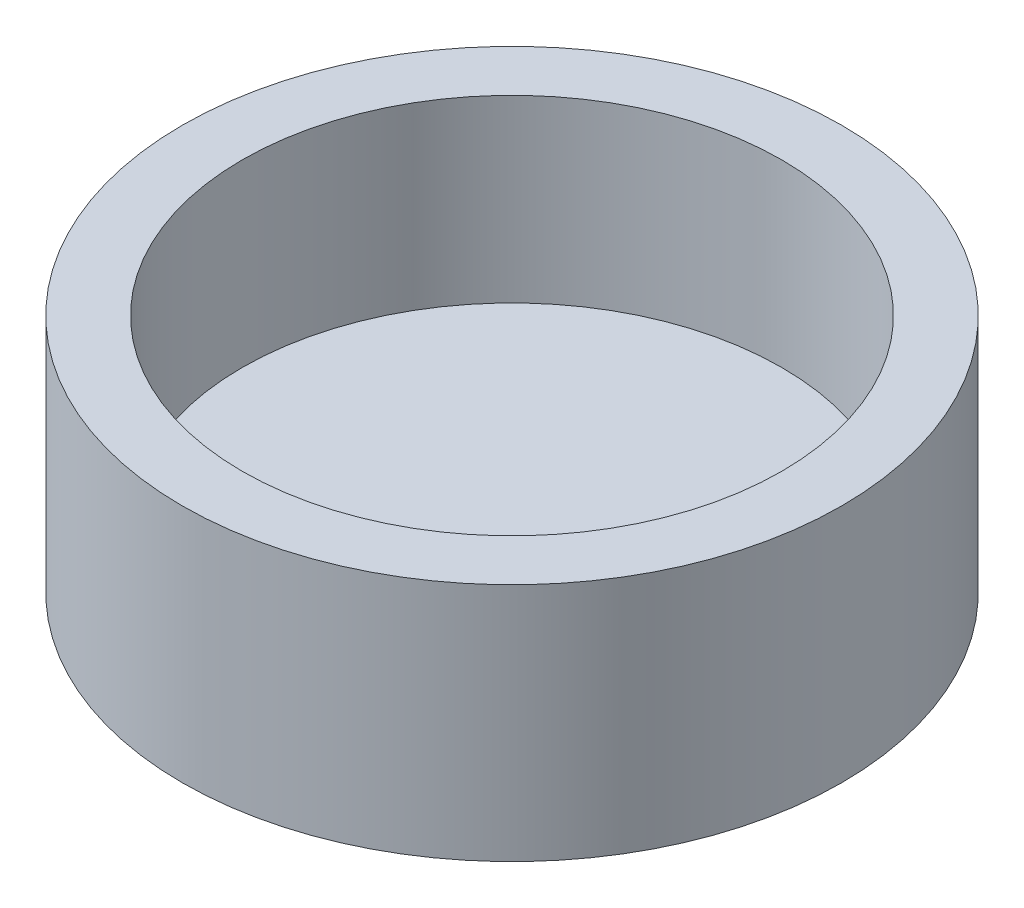
ISO-10303-21;
HEADER;
FILE_DESCRIPTION(('STEP AP214'),'2;1');
FILE_NAME('part.step','',(''),(''),'','','');
FILE_SCHEMA(('AUTOMOTIVE_DESIGN { 1 0 10303 214 1 1 1 1 }'));
ENDSEC;
DATA;
#1=APPLICATION_CONTEXT('core data for automotive mechanical design processes');
#2=APPLICATION_PROTOCOL_DEFINITION('international standard','automotive_design',2000,#1);
#3=PRODUCT_CONTEXT('',#1,'mechanical');
#4=PRODUCT('Part','Part','',(#3));
#5=PRODUCT_RELATED_PRODUCT_CATEGORY('part','',(#4));
#6=PRODUCT_DEFINITION_FORMATION('','',#4);
#7=PRODUCT_DEFINITION_CONTEXT('part definition',#1,'design');
#8=PRODUCT_DEFINITION('design','',#6,#7);
#9=PRODUCT_DEFINITION_SHAPE('','',#8);
#10=(LENGTH_UNIT() NAMED_UNIT(*) SI_UNIT(.MILLI.,.METRE.));
#11=(NAMED_UNIT(*) PLANE_ANGLE_UNIT() SI_UNIT($,.RADIAN.));
#12=(NAMED_UNIT(*) SI_UNIT($,.STERADIAN.) SOLID_ANGLE_UNIT());
#13=UNCERTAINTY_MEASURE_WITH_UNIT(LENGTH_MEASURE(1.E-05),#10,'distance_accuracy_value','');
#14=(GEOMETRIC_REPRESENTATION_CONTEXT(3) GLOBAL_UNCERTAINTY_ASSIGNED_CONTEXT((#13)) GLOBAL_UNIT_ASSIGNED_CONTEXT((#10,
#11,#12)) REPRESENTATION_CONTEXT('',''));
#15=CARTESIAN_POINT('',(0.,0.,0.));
#16=DIRECTION('',(0.,0.,1.));
#17=DIRECTION('',(1.,0.,0.));
#18=AXIS2_PLACEMENT_3D('',#15,#16,#17);
#19=CARTESIAN_POINT('',(0.,4.,0.));
#20=DIRECTION('',(0.,-1.,0.));
#21=DIRECTION('',(0.,0.,-1.));
#22=AXIS2_PLACEMENT_3D('',#19,#20,#21);
#23=CYLINDRICAL_SURFACE('',#22,5.5);
#24=CARTESIAN_POINT('',(0.,4.,0.));
#25=DIRECTION('',(0.,1.,0.));
#26=DIRECTION('',(0.,0.,1.));
#27=AXIS2_PLACEMENT_3D('',#24,#25,#26);
#28=CIRCLE('',#27,5.5);
#29=CARTESIAN_POINT('',(0.,4.,5.5));
#30=VERTEX_POINT('',#29);
#31=EDGE_CURVE('E10',#30,#30,#28,.T.);
#32=ORIENTED_EDGE('',*,*,#31,.F.);
#33=EDGE_LOOP('',(#32));
#34=FACE_BOUND('',#33,.T.);
#35=CARTESIAN_POINT('',(0.,0.,0.));
#36=DIRECTION('',(0.,1.,0.));
#37=DIRECTION('',(0.,0.,1.));
#38=AXIS2_PLACEMENT_3D('',#35,#36,#37);
#39=CIRCLE('',#38,5.5);
#40=CARTESIAN_POINT('',(0.,0.,5.5));
#41=VERTEX_POINT('',#40);
#42=EDGE_CURVE('E42',#41,#41,#39,.T.);
#43=ORIENTED_EDGE('',*,*,#42,.T.);
#44=EDGE_LOOP('',(#43));
#45=FACE_BOUND('',#44,.T.);
#46=ADVANCED_FACE('F39',(#34,#45),#23,.T.);
#47=CARTESIAN_POINT('',(0.,4.,0.));
#48=DIRECTION('',(0.,1.,0.));
#49=DIRECTION('',(0.,0.,1.));
#50=AXIS2_PLACEMENT_3D('',#47,#48,#49);
#51=PLANE('',#50);
#52=CARTESIAN_POINT('',(0.,4.,0.));
#53=DIRECTION('',(0.,1.,0.));
#54=DIRECTION('',(0.,0.,1.));
#55=AXIS2_PLACEMENT_3D('',#52,#53,#54);
#56=CIRCLE('',#55,4.5);
#57=CARTESIAN_POINT('',(0.,4.,4.5));
#58=VERTEX_POINT('',#57);
#59=EDGE_CURVE('E51',#58,#58,#56,.T.);
#60=ORIENTED_EDGE('',*,*,#59,.F.);
#61=EDGE_LOOP('',(#60));
#62=FACE_BOUND('',#61,.T.);
#63=ORIENTED_EDGE('',*,*,#31,.T.);
#64=EDGE_LOOP('',(#63));
#65=FACE_BOUND('',#64,.T.);
#66=ADVANCED_FACE('F66',(#62,#65),#51,.T.);
#67=CARTESIAN_POINT('',(0.,0.,0.));
#68=DIRECTION('',(0.,1.,0.));
#69=DIRECTION('',(0.,0.,1.));
#70=AXIS2_PLACEMENT_3D('',#67,#68,#69);
#71=PLANE('',#70);
#72=ORIENTED_EDGE('',*,*,#42,.F.);
#73=EDGE_LOOP('',(#72));
#74=FACE_BOUND('',#73,.T.);
#75=ADVANCED_FACE('F62',(#74),#71,.F.);
#76=CARTESIAN_POINT('',(0.,1.,0.));
#77=DIRECTION('',(0.,1.,0.));
#78=DIRECTION('',(0.,0.,1.));
#79=AXIS2_PLACEMENT_3D('',#76,#77,#78);
#80=CYLINDRICAL_SURFACE('',#79,4.5);
#81=CARTESIAN_POINT('',(0.,1.,0.));
#82=DIRECTION('',(0.,1.,0.));
#83=DIRECTION('',(0.,0.,1.));
#84=AXIS2_PLACEMENT_3D('',#81,#82,#83);
#85=CIRCLE('',#84,4.5);
#86=CARTESIAN_POINT('',(0.,1.,4.5));
#87=VERTEX_POINT('',#86);
#88=EDGE_CURVE('E49',#87,#87,#85,.T.);
#89=ORIENTED_EDGE('',*,*,#88,.F.);
#90=EDGE_LOOP('',(#89));
#91=FACE_BOUND('',#90,.T.);
#92=ORIENTED_EDGE('',*,*,#59,.T.);
#93=EDGE_LOOP('',(#92));
#94=FACE_BOUND('',#93,.T.);
#95=ADVANCED_FACE('F59',(#91,#94),#80,.F.);
#96=CARTESIAN_POINT('',(0.,1.,0.));
#97=DIRECTION('',(0.,1.,0.));
#98=DIRECTION('',(0.,0.,1.));
#99=AXIS2_PLACEMENT_3D('',#96,#97,#98);
#100=PLANE('',#99);
#101=ORIENTED_EDGE('',*,*,#88,.T.);
#102=EDGE_LOOP('',(#101));
#103=FACE_BOUND('',#102,.T.);
#104=ADVANCED_FACE('F57',(#103),#100,.T.);
#105=CLOSED_SHELL('',(#46,#66,#75,#95,#104));
#106=MANIFOLD_SOLID_BREP('B2',#105);
#107=ADVANCED_BREP_SHAPE_REPRESENTATION('',(#18,#106),#14);
#108=SHAPE_DEFINITION_REPRESENTATION(#9,#107);
ENDSEC;
END-ISO-10303-21;
